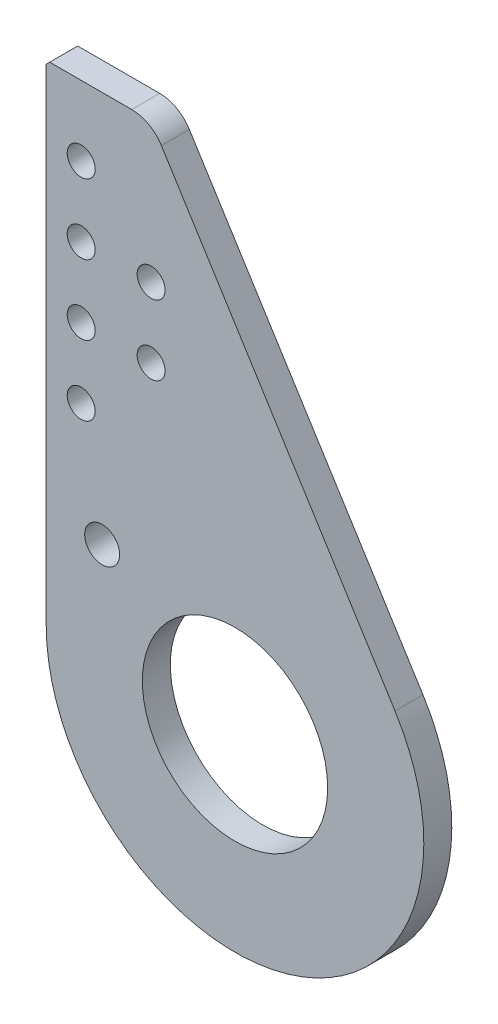
ISO-10303-21;
HEADER;
FILE_DESCRIPTION(('STEP AP214'),'2;1');
FILE_NAME('part.step','',(''),(''),'','','');
FILE_SCHEMA(('AUTOMOTIVE_DESIGN { 1 0 10303 214 1 1 1 1 }'));
ENDSEC;
DATA;
#1=APPLICATION_CONTEXT('core data for automotive mechanical design processes');
#2=APPLICATION_PROTOCOL_DEFINITION('international standard','automotive_design',2000,#1);
#3=PRODUCT_CONTEXT('',#1,'mechanical');
#4=PRODUCT('Part','Part','',(#3));
#5=PRODUCT_RELATED_PRODUCT_CATEGORY('part','',(#4));
#6=PRODUCT_DEFINITION_FORMATION('','',#4);
#7=PRODUCT_DEFINITION_CONTEXT('part definition',#1,'design');
#8=PRODUCT_DEFINITION('design','',#6,#7);
#9=PRODUCT_DEFINITION_SHAPE('','',#8);
#10=(LENGTH_UNIT() NAMED_UNIT(*) SI_UNIT(.MILLI.,.METRE.));
#11=(NAMED_UNIT(*) PLANE_ANGLE_UNIT() SI_UNIT($,.RADIAN.));
#12=(NAMED_UNIT(*) SI_UNIT($,.STERADIAN.) SOLID_ANGLE_UNIT());
#13=UNCERTAINTY_MEASURE_WITH_UNIT(LENGTH_MEASURE(1.E-05),#10,'distance_accuracy_value','');
#14=(GEOMETRIC_REPRESENTATION_CONTEXT(3) GLOBAL_UNCERTAINTY_ASSIGNED_CONTEXT((#13)) GLOBAL_UNIT_ASSIGNED_CONTEXT((#10,
#11,#12)) REPRESENTATION_CONTEXT('',''));
#15=CARTESIAN_POINT('',(0.,0.,0.));
#16=DIRECTION('',(0.,0.,1.));
#17=DIRECTION('',(1.,0.,0.));
#18=AXIS2_PLACEMENT_3D('',#15,#16,#17);
#19=CARTESIAN_POINT('',(0.,0.,4.));
#20=DIRECTION('',(0.,0.,1.));
#21=DIRECTION('',(1.,0.,0.));
#22=AXIS2_PLACEMENT_3D('',#19,#20,#21);
#23=PLANE('',#22);
#24=CARTESIAN_POINT('',(-22.,40.,4.));
#25=DIRECTION('',(0.,0.,1.));
#26=DIRECTION('',(1.,0.,0.));
#27=AXIS2_PLACEMENT_3D('',#24,#25,#26);
#28=CIRCLE('',#27,2.00000000000001);
#29=CARTESIAN_POINT('',(-20.,40.,4.));
#30=VERTEX_POINT('',#29);
#31=EDGE_CURVE('E184',#30,#30,#28,.T.);
#32=ORIENTED_EDGE('',*,*,#31,.F.);
#33=EDGE_LOOP('',(#32));
#34=FACE_BOUND('',#33,.T.);
#35=CARTESIAN_POINT('',(-22.,30.,4.));
#36=DIRECTION('',(0.,0.,1.));
#37=DIRECTION('',(1.,0.,0.));
#38=AXIS2_PLACEMENT_3D('',#35,#36,#37);
#39=CIRCLE('',#38,2.00000000000001);
#40=CARTESIAN_POINT('',(-20.,30.,4.));
#41=VERTEX_POINT('',#40);
#42=EDGE_CURVE('E172',#41,#41,#39,.T.);
#43=ORIENTED_EDGE('',*,*,#42,.F.);
#44=EDGE_LOOP('',(#43));
#45=FACE_BOUND('',#44,.T.);
#46=CARTESIAN_POINT('',(-22.,60.,4.));
#47=DIRECTION('',(0.,0.,1.));
#48=DIRECTION('',(1.,0.,0.));
#49=AXIS2_PLACEMENT_3D('',#46,#47,#48);
#50=CIRCLE('',#49,2.);
#51=CARTESIAN_POINT('',(-20.,60.,4.));
#52=VERTEX_POINT('',#51);
#53=EDGE_CURVE('E160',#52,#52,#50,.T.);
#54=ORIENTED_EDGE('',*,*,#53,.F.);
#55=EDGE_LOOP('',(#54));
#56=FACE_BOUND('',#55,.T.);
#57=CARTESIAN_POINT('',(-12.,40.,4.));
#58=DIRECTION('',(0.,0.,1.));
#59=DIRECTION('',(1.,0.,0.));
#60=AXIS2_PLACEMENT_3D('',#57,#58,#59);
#61=CIRCLE('',#60,2.);
#62=CARTESIAN_POINT('',(-10.,40.,4.));
#63=VERTEX_POINT('',#62);
#64=EDGE_CURVE('E148',#63,#63,#61,.T.);
#65=ORIENTED_EDGE('',*,*,#64,.F.);
#66=EDGE_LOOP('',(#65));
#67=FACE_BOUND('',#66,.T.);
#68=DIRECTION('',(-1.,0.,0.));
#69=VECTOR('',#68,1.);
#70=CARTESIAN_POINT('',(-27.,70.,4.));
#71=LINE('',#70,#69);
#72=CARTESIAN_POINT('',(-14.7674539749688,70.,4.));
#73=VERTEX_POINT('',#72);
#74=CARTESIAN_POINT('',(-26.5,70.,4.));
#75=VERTEX_POINT('',#74);
#76=EDGE_CURVE('E104',#73,#75,#71,.T.);
#77=ORIENTED_EDGE('',*,*,#76,.T.);
#78=DIRECTION('',(0.707106781186548,0.707106781186548,0.));
#79=VECTOR('',#78,1.);
#80=CARTESIAN_POINT('',(-48.25,48.25,4.));
#81=LINE('',#80,#79);
#82=CARTESIAN_POINT('',(-27.,69.5,4.));
#83=VERTEX_POINT('',#82);
#84=EDGE_CURVE('E11',#75,#83,#81,.F.);
#85=ORIENTED_EDGE('',*,*,#84,.T.);
#86=DIRECTION('',(0.,-1.,0.));
#87=VECTOR('',#86,1.);
#88=CARTESIAN_POINT('',(-27.,0.,4.));
#89=LINE('',#88,#87);
#90=CARTESIAN_POINT('',(-27.,0.,4.));
#91=VERTEX_POINT('',#90);
#92=EDGE_CURVE('E110',#83,#91,#89,.T.);
#93=ORIENTED_EDGE('',*,*,#92,.T.);
#94=CARTESIAN_POINT('',(0.,0.,4.));
#95=DIRECTION('',(0.,0.,1.));
#96=DIRECTION('',(1.,0.,0.));
#97=AXIS2_PLACEMENT_3D('',#94,#95,#96);
#98=CIRCLE('',#97,27.);
#99=CARTESIAN_POINT('',(22.8793753525154,14.3364634229893,4.));
#100=VERTEX_POINT('',#99);
#101=EDGE_CURVE('E105',#91,#100,#98,.T.);
#102=ORIENTED_EDGE('',*,*,#101,.T.);
#103=DIRECTION('',(-0.530980126777383,0.847384272315385,0.));
#104=VECTOR('',#103,1.);
#105=CARTESIAN_POINT('',(-11.9999971755815,70.,4.));
#106=LINE('',#105,#104);
#107=CARTESIAN_POINT('',(-10.5305326133919,67.6549006338869,4.));
#108=VERTEX_POINT('',#107);
#109=EDGE_CURVE('E93',#100,#108,#106,.T.);
#110=ORIENTED_EDGE('',*,*,#109,.T.);
#111=CARTESIAN_POINT('',(-14.7674539749688,65.,4.));
#112=DIRECTION('',(0.,0.,1.));
#113=DIRECTION('',(1.,0.,0.));
#114=AXIS2_PLACEMENT_3D('',#111,#112,#113);
#115=CIRCLE('',#114,5.);
#116=EDGE_CURVE('E130',#108,#73,#115,.T.);
#117=ORIENTED_EDGE('',*,*,#116,.T.);
#118=EDGE_LOOP('',(#77,#85,#93,#102,#110,#117));
#119=FACE_BOUND('',#118,.T.);
#120=CARTESIAN_POINT('',(-19.,14.,4.));
#121=DIRECTION('',(0.,0.,1.));
#122=DIRECTION('',(1.,0.,0.));
#123=AXIS2_PLACEMENT_3D('',#120,#121,#122);
#124=CIRCLE('',#123,2.5);
#125=CARTESIAN_POINT('',(-16.5,14.,4.));
#126=VERTEX_POINT('',#125);
#127=EDGE_CURVE('E154',#126,#126,#124,.T.);
#128=ORIENTED_EDGE('',*,*,#127,.F.);
#129=EDGE_LOOP('',(#128));
#130=FACE_BOUND('',#129,.T.);
#131=CARTESIAN_POINT('',(-22.,50.,4.));
#132=DIRECTION('',(0.,0.,1.));
#133=DIRECTION('',(1.,0.,0.));
#134=AXIS2_PLACEMENT_3D('',#131,#132,#133);
#135=CIRCLE('',#134,2.);
#136=CARTESIAN_POINT('',(-20.,50.,4.));
#137=VERTEX_POINT('',#136);
#138=EDGE_CURVE('E166',#137,#137,#135,.T.);
#139=ORIENTED_EDGE('',*,*,#138,.F.);
#140=EDGE_LOOP('',(#139));
#141=FACE_BOUND('',#140,.T.);
#142=CARTESIAN_POINT('',(0.,0.,4.));
#143=DIRECTION('',(0.,0.,1.));
#144=DIRECTION('',(1.,0.,0.));
#145=AXIS2_PLACEMENT_3D('',#142,#143,#144);
#146=CIRCLE('',#145,13.25);
#147=CARTESIAN_POINT('',(13.25,0.,4.));
#148=VERTEX_POINT('',#147);
#149=EDGE_CURVE('E178',#148,#148,#146,.T.);
#150=ORIENTED_EDGE('',*,*,#149,.F.);
#151=EDGE_LOOP('',(#150));
#152=FACE_BOUND('',#151,.T.);
#153=CARTESIAN_POINT('',(-12.,50.,4.));
#154=DIRECTION('',(0.,0.,1.));
#155=DIRECTION('',(1.,0.,0.));
#156=AXIS2_PLACEMENT_3D('',#153,#154,#155);
#157=CIRCLE('',#156,2.);
#158=CARTESIAN_POINT('',(-10.,50.,4.));
#159=VERTEX_POINT('',#158);
#160=EDGE_CURVE('E190',#159,#159,#157,.T.);
#161=ORIENTED_EDGE('',*,*,#160,.F.);
#162=EDGE_LOOP('',(#161));
#163=FACE_BOUND('',#162,.T.);
#164=ADVANCED_FACE('F39',(#34,#45,#56,#67,#119,#130,#141,#152,#163),#23,.T.);
#165=CARTESIAN_POINT('',(0.,0.,0.));
#166=DIRECTION('',(0.,0.,1.));
#167=DIRECTION('',(1.,0.,0.));
#168=AXIS2_PLACEMENT_3D('',#165,#166,#167);
#169=PLANE('',#168);
#170=DIRECTION('',(0.,-1.,0.));
#171=VECTOR('',#170,1.);
#172=CARTESIAN_POINT('',(-27.,0.,0.));
#173=LINE('',#172,#171);
#174=CARTESIAN_POINT('',(-27.,69.5,0.));
#175=VERTEX_POINT('',#174);
#176=CARTESIAN_POINT('',(-27.,0.,0.));
#177=VERTEX_POINT('',#176);
#178=EDGE_CURVE('E114',#175,#177,#173,.T.);
#179=ORIENTED_EDGE('',*,*,#178,.F.);
#180=DIRECTION('',(-0.707106781186548,-0.707106781186548,0.));
#181=VECTOR('',#180,1.);
#182=CARTESIAN_POINT('',(-27.,69.5,0.));
#183=LINE('',#182,#181);
#184=CARTESIAN_POINT('',(-26.5,70.,0.));
#185=VERTEX_POINT('',#184);
#186=EDGE_CURVE('E62',#175,#185,#183,.F.);
#187=ORIENTED_EDGE('',*,*,#186,.T.);
#188=DIRECTION('',(-1.,0.,0.));
#189=VECTOR('',#188,1.);
#190=CARTESIAN_POINT('',(-27.,70.,0.));
#191=LINE('',#190,#189);
#192=CARTESIAN_POINT('',(-14.7674539749688,70.,0.));
#193=VERTEX_POINT('',#192);
#194=EDGE_CURVE('E142',#193,#185,#191,.T.);
#195=ORIENTED_EDGE('',*,*,#194,.F.);
#196=CARTESIAN_POINT('',(-14.7674539749688,65.,0.));
#197=DIRECTION('',(0.,0.,1.));
#198=DIRECTION('',(1.,0.,0.));
#199=AXIS2_PLACEMENT_3D('',#196,#197,#198);
#200=CIRCLE('',#199,5.);
#201=CARTESIAN_POINT('',(-10.5305326133919,67.6549006338869,0.));
#202=VERTEX_POINT('',#201);
#203=EDGE_CURVE('E123',#193,#202,#200,.F.);
#204=ORIENTED_EDGE('',*,*,#203,.T.);
#205=DIRECTION('',(-0.530980126777383,0.847384272315385,0.));
#206=VECTOR('',#205,1.);
#207=CARTESIAN_POINT('',(-11.9999971755815,70.,0.));
#208=LINE('',#207,#206);
#209=CARTESIAN_POINT('',(22.8793753525154,14.3364634229893,0.));
#210=VERTEX_POINT('',#209);
#211=EDGE_CURVE('E143',#210,#202,#208,.T.);
#212=ORIENTED_EDGE('',*,*,#211,.F.);
#213=CARTESIAN_POINT('',(0.,0.,0.));
#214=DIRECTION('',(0.,0.,1.));
#215=DIRECTION('',(1.,0.,0.));
#216=AXIS2_PLACEMENT_3D('',#213,#214,#215);
#217=CIRCLE('',#216,27.);
#218=EDGE_CURVE('E118',#177,#210,#217,.T.);
#219=ORIENTED_EDGE('',*,*,#218,.F.);
#220=EDGE_LOOP('',(#179,#187,#195,#204,#212,#219));
#221=FACE_BOUND('',#220,.T.);
#222=CARTESIAN_POINT('',(-12.,40.,0.));
#223=DIRECTION('',(0.,0.,1.));
#224=DIRECTION('',(1.,0.,0.));
#225=AXIS2_PLACEMENT_3D('',#222,#223,#224);
#226=CIRCLE('',#225,2.);
#227=CARTESIAN_POINT('',(-10.,40.,0.));
#228=VERTEX_POINT('',#227);
#229=EDGE_CURVE('E151',#228,#228,#226,.T.);
#230=ORIENTED_EDGE('',*,*,#229,.T.);
#231=EDGE_LOOP('',(#230));
#232=FACE_BOUND('',#231,.T.);
#233=CARTESIAN_POINT('',(-19.,14.,0.));
#234=DIRECTION('',(0.,0.,1.));
#235=DIRECTION('',(1.,0.,0.));
#236=AXIS2_PLACEMENT_3D('',#233,#234,#235);
#237=CIRCLE('',#236,2.5);
#238=CARTESIAN_POINT('',(-16.5,14.,0.));
#239=VERTEX_POINT('',#238);
#240=EDGE_CURVE('E157',#239,#239,#237,.T.);
#241=ORIENTED_EDGE('',*,*,#240,.T.);
#242=EDGE_LOOP('',(#241));
#243=FACE_BOUND('',#242,.T.);
#244=CARTESIAN_POINT('',(-22.,60.,0.));
#245=DIRECTION('',(0.,0.,1.));
#246=DIRECTION('',(1.,0.,0.));
#247=AXIS2_PLACEMENT_3D('',#244,#245,#246);
#248=CIRCLE('',#247,2.);
#249=CARTESIAN_POINT('',(-20.,60.,0.));
#250=VERTEX_POINT('',#249);
#251=EDGE_CURVE('E163',#250,#250,#248,.T.);
#252=ORIENTED_EDGE('',*,*,#251,.T.);
#253=EDGE_LOOP('',(#252));
#254=FACE_BOUND('',#253,.T.);
#255=CARTESIAN_POINT('',(-22.,50.,0.));
#256=DIRECTION('',(0.,0.,1.));
#257=DIRECTION('',(1.,0.,0.));
#258=AXIS2_PLACEMENT_3D('',#255,#256,#257);
#259=CIRCLE('',#258,2.);
#260=CARTESIAN_POINT('',(-20.,50.,0.));
#261=VERTEX_POINT('',#260);
#262=EDGE_CURVE('E169',#261,#261,#259,.T.);
#263=ORIENTED_EDGE('',*,*,#262,.T.);
#264=EDGE_LOOP('',(#263));
#265=FACE_BOUND('',#264,.T.);
#266=CARTESIAN_POINT('',(-22.,30.,0.));
#267=DIRECTION('',(0.,0.,1.));
#268=DIRECTION('',(1.,0.,0.));
#269=AXIS2_PLACEMENT_3D('',#266,#267,#268);
#270=CIRCLE('',#269,2.00000000000001);
#271=CARTESIAN_POINT('',(-20.,30.,0.));
#272=VERTEX_POINT('',#271);
#273=EDGE_CURVE('E175',#272,#272,#270,.T.);
#274=ORIENTED_EDGE('',*,*,#273,.T.);
#275=EDGE_LOOP('',(#274));
#276=FACE_BOUND('',#275,.T.);
#277=CARTESIAN_POINT('',(0.,0.,0.));
#278=DIRECTION('',(0.,0.,1.));
#279=DIRECTION('',(1.,0.,0.));
#280=AXIS2_PLACEMENT_3D('',#277,#278,#279);
#281=CIRCLE('',#280,13.25);
#282=CARTESIAN_POINT('',(13.25,0.,0.));
#283=VERTEX_POINT('',#282);
#284=EDGE_CURVE('E181',#283,#283,#281,.T.);
#285=ORIENTED_EDGE('',*,*,#284,.T.);
#286=EDGE_LOOP('',(#285));
#287=FACE_BOUND('',#286,.T.);
#288=CARTESIAN_POINT('',(-22.,40.,0.));
#289=DIRECTION('',(0.,0.,1.));
#290=DIRECTION('',(1.,0.,0.));
#291=AXIS2_PLACEMENT_3D('',#288,#289,#290);
#292=CIRCLE('',#291,2.00000000000001);
#293=CARTESIAN_POINT('',(-20.,40.,0.));
#294=VERTEX_POINT('',#293);
#295=EDGE_CURVE('E187',#294,#294,#292,.T.);
#296=ORIENTED_EDGE('',*,*,#295,.T.);
#297=EDGE_LOOP('',(#296));
#298=FACE_BOUND('',#297,.T.);
#299=CARTESIAN_POINT('',(-12.,50.,0.));
#300=DIRECTION('',(0.,0.,1.));
#301=DIRECTION('',(1.,0.,0.));
#302=AXIS2_PLACEMENT_3D('',#299,#300,#301);
#303=CIRCLE('',#302,2.);
#304=CARTESIAN_POINT('',(-10.,50.,0.));
#305=VERTEX_POINT('',#304);
#306=EDGE_CURVE('E193',#305,#305,#303,.T.);
#307=ORIENTED_EDGE('',*,*,#306,.T.);
#308=EDGE_LOOP('',(#307));
#309=FACE_BOUND('',#308,.T.);
#310=ADVANCED_FACE('F140',(#221,#232,#243,#254,#265,#276,#287,#298,#309),#169,.F.);
#311=CARTESIAN_POINT('',(0.,0.,4.));
#312=DIRECTION('',(0.,0.,-1.));
#313=DIRECTION('',(-1.,0.,0.));
#314=AXIS2_PLACEMENT_3D('',#311,#312,#313);
#315=CYLINDRICAL_SURFACE('',#314,27.);
#316=ORIENTED_EDGE('',*,*,#218,.T.);
#317=DIRECTION('',(0.,0.,-1.));
#318=VECTOR('',#317,1.);
#319=CARTESIAN_POINT('',(22.8793753525154,14.3364634229893,4.));
#320=LINE('',#319,#318);
#321=EDGE_CURVE('E98',#100,#210,#320,.T.);
#322=ORIENTED_EDGE('',*,*,#321,.F.);
#323=ORIENTED_EDGE('',*,*,#101,.F.);
#324=DIRECTION('',(0.,0.,-1.));
#325=VECTOR('',#324,1.);
#326=CARTESIAN_POINT('',(-27.,0.,4.));
#327=LINE('',#326,#325);
#328=EDGE_CURVE('E120',#91,#177,#327,.T.);
#329=ORIENTED_EDGE('',*,*,#328,.T.);
#330=EDGE_LOOP('',(#316,#322,#323,#329));
#331=FACE_BOUND('',#330,.T.);
#332=ADVANCED_FACE('F116',(#331),#315,.T.);
#333=CARTESIAN_POINT('',(-11.9999971755815,70.,4.));
#334=DIRECTION('',(-0.847384272315385,-0.530980126777383,0.));
#335=DIRECTION('',(0.530980126777383,-0.847384272315385,0.));
#336=AXIS2_PLACEMENT_3D('',#333,#334,#335);
#337=PLANE('',#336);
#338=ORIENTED_EDGE('',*,*,#211,.T.);
#339=DIRECTION('',(0.,0.,-1.));
#340=VECTOR('',#339,1.);
#341=CARTESIAN_POINT('',(-10.5305326133919,67.6549006338869,4.));
#342=LINE('',#341,#340);
#343=EDGE_CURVE('E101',#202,#108,#342,.F.);
#344=ORIENTED_EDGE('',*,*,#343,.T.);
#345=ORIENTED_EDGE('',*,*,#109,.F.);
#346=ORIENTED_EDGE('',*,*,#321,.T.);
#347=EDGE_LOOP('',(#338,#344,#345,#346));
#348=FACE_BOUND('',#347,.T.);
#349=ADVANCED_FACE('F96',(#348),#337,.F.);
#350=CARTESIAN_POINT('',(-27.,70.,4.));
#351=DIRECTION('',(0.,-1.,0.));
#352=DIRECTION('',(0.,0.,-1.));
#353=AXIS2_PLACEMENT_3D('',#350,#351,#352);
#354=PLANE('',#353);
#355=ORIENTED_EDGE('',*,*,#194,.T.);
#356=DIRECTION('',(0.,0.,1.));
#357=VECTOR('',#356,1.);
#358=CARTESIAN_POINT('',(-26.5,70.,4.));
#359=LINE('',#358,#357);
#360=EDGE_CURVE('E48',#185,#75,#359,.T.);
#361=ORIENTED_EDGE('',*,*,#360,.T.);
#362=ORIENTED_EDGE('',*,*,#76,.F.);
#363=DIRECTION('',(0.,0.,-1.));
#364=VECTOR('',#363,1.);
#365=CARTESIAN_POINT('',(-14.7674539749688,70.,4.));
#366=LINE('',#365,#364);
#367=EDGE_CURVE('E119',#73,#193,#366,.T.);
#368=ORIENTED_EDGE('',*,*,#367,.T.);
#369=EDGE_LOOP('',(#355,#361,#362,#368));
#370=FACE_BOUND('',#369,.T.);
#371=ADVANCED_FACE('F217',(#370),#354,.F.);
#372=CARTESIAN_POINT('',(-27.,0.,4.));
#373=DIRECTION('',(1.,0.,0.));
#374=DIRECTION('',(0.,0.,-1.));
#375=AXIS2_PLACEMENT_3D('',#372,#373,#374);
#376=PLANE('',#375);
#377=ORIENTED_EDGE('',*,*,#92,.F.);
#378=DIRECTION('',(0.,0.,-1.));
#379=VECTOR('',#378,1.);
#380=CARTESIAN_POINT('',(-27.,69.5,4.));
#381=LINE('',#380,#379);
#382=EDGE_CURVE('E132',#83,#175,#381,.T.);
#383=ORIENTED_EDGE('',*,*,#382,.T.);
#384=ORIENTED_EDGE('',*,*,#178,.T.);
#385=ORIENTED_EDGE('',*,*,#328,.F.);
#386=EDGE_LOOP('',(#377,#383,#384,#385));
#387=FACE_BOUND('',#386,.T.);
#388=ADVANCED_FACE('F137',(#387),#376,.F.);
#389=CARTESIAN_POINT('',(-12.,40.,4.));
#390=DIRECTION('',(0.,0.,-1.));
#391=DIRECTION('',(-1.,0.,0.));
#392=AXIS2_PLACEMENT_3D('',#389,#390,#391);
#393=CYLINDRICAL_SURFACE('',#392,2.);
#394=ORIENTED_EDGE('',*,*,#64,.T.);
#395=EDGE_LOOP('',(#394));
#396=FACE_BOUND('',#395,.T.);
#397=ORIENTED_EDGE('',*,*,#229,.F.);
#398=EDGE_LOOP('',(#397));
#399=FACE_BOUND('',#398,.T.);
#400=ADVANCED_FACE('F212',(#396,#399),#393,.F.);
#401=CARTESIAN_POINT('',(-19.,14.,4.));
#402=DIRECTION('',(0.,0.,-1.));
#403=DIRECTION('',(-1.,0.,0.));
#404=AXIS2_PLACEMENT_3D('',#401,#402,#403);
#405=CYLINDRICAL_SURFACE('',#404,2.5);
#406=ORIENTED_EDGE('',*,*,#127,.T.);
#407=EDGE_LOOP('',(#406));
#408=FACE_BOUND('',#407,.T.);
#409=ORIENTED_EDGE('',*,*,#240,.F.);
#410=EDGE_LOOP('',(#409));
#411=FACE_BOUND('',#410,.T.);
#412=ADVANCED_FACE('F253',(#408,#411),#405,.F.);
#413=CARTESIAN_POINT('',(-22.,60.,4.));
#414=DIRECTION('',(0.,0.,-1.));
#415=DIRECTION('',(-1.,0.,0.));
#416=AXIS2_PLACEMENT_3D('',#413,#414,#415);
#417=CYLINDRICAL_SURFACE('',#416,2.);
#418=ORIENTED_EDGE('',*,*,#53,.T.);
#419=EDGE_LOOP('',(#418));
#420=FACE_BOUND('',#419,.T.);
#421=ORIENTED_EDGE('',*,*,#251,.F.);
#422=EDGE_LOOP('',(#421));
#423=FACE_BOUND('',#422,.T.);
#424=ADVANCED_FACE('F250',(#420,#423),#417,.F.);
#425=CARTESIAN_POINT('',(-22.,50.,4.));
#426=DIRECTION('',(0.,0.,-1.));
#427=DIRECTION('',(-1.,0.,0.));
#428=AXIS2_PLACEMENT_3D('',#425,#426,#427);
#429=CYLINDRICAL_SURFACE('',#428,2.);
#430=ORIENTED_EDGE('',*,*,#138,.T.);
#431=EDGE_LOOP('',(#430));
#432=FACE_BOUND('',#431,.T.);
#433=ORIENTED_EDGE('',*,*,#262,.F.);
#434=EDGE_LOOP('',(#433));
#435=FACE_BOUND('',#434,.T.);
#436=ADVANCED_FACE('F246',(#432,#435),#429,.F.);
#437=CARTESIAN_POINT('',(-22.,30.,4.));
#438=DIRECTION('',(0.,0.,-1.));
#439=DIRECTION('',(-1.,0.,0.));
#440=AXIS2_PLACEMENT_3D('',#437,#438,#439);
#441=CYLINDRICAL_SURFACE('',#440,2.00000000000001);
#442=ORIENTED_EDGE('',*,*,#42,.T.);
#443=EDGE_LOOP('',(#442));
#444=FACE_BOUND('',#443,.T.);
#445=ORIENTED_EDGE('',*,*,#273,.F.);
#446=EDGE_LOOP('',(#445));
#447=FACE_BOUND('',#446,.T.);
#448=ADVANCED_FACE('F242',(#444,#447),#441,.F.);
#449=CARTESIAN_POINT('',(0.,0.,4.));
#450=DIRECTION('',(0.,0.,-1.));
#451=DIRECTION('',(-1.,0.,0.));
#452=AXIS2_PLACEMENT_3D('',#449,#450,#451);
#453=CYLINDRICAL_SURFACE('',#452,13.25);
#454=ORIENTED_EDGE('',*,*,#149,.T.);
#455=EDGE_LOOP('',(#454));
#456=FACE_BOUND('',#455,.T.);
#457=ORIENTED_EDGE('',*,*,#284,.F.);
#458=EDGE_LOOP('',(#457));
#459=FACE_BOUND('',#458,.T.);
#460=ADVANCED_FACE('F236',(#456,#459),#453,.F.);
#461=CARTESIAN_POINT('',(-22.,40.,4.));
#462=DIRECTION('',(0.,0.,-1.));
#463=DIRECTION('',(-1.,0.,0.));
#464=AXIS2_PLACEMENT_3D('',#461,#462,#463);
#465=CYLINDRICAL_SURFACE('',#464,2.00000000000001);
#466=ORIENTED_EDGE('',*,*,#31,.T.);
#467=EDGE_LOOP('',(#466));
#468=FACE_BOUND('',#467,.T.);
#469=ORIENTED_EDGE('',*,*,#295,.F.);
#470=EDGE_LOOP('',(#469));
#471=FACE_BOUND('',#470,.T.);
#472=ADVANCED_FACE('F230',(#468,#471),#465,.F.);
#473=CARTESIAN_POINT('',(-12.,50.,4.));
#474=DIRECTION('',(0.,0.,-1.));
#475=DIRECTION('',(-1.,0.,0.));
#476=AXIS2_PLACEMENT_3D('',#473,#474,#475);
#477=CYLINDRICAL_SURFACE('',#476,2.);
#478=ORIENTED_EDGE('',*,*,#160,.T.);
#479=EDGE_LOOP('',(#478));
#480=FACE_BOUND('',#479,.T.);
#481=ORIENTED_EDGE('',*,*,#306,.F.);
#482=EDGE_LOOP('',(#481));
#483=FACE_BOUND('',#482,.T.);
#484=ADVANCED_FACE('F199',(#480,#483),#477,.F.);
#485=CARTESIAN_POINT('',(-14.7674539749688,65.,4.));
#486=DIRECTION('',(0.,0.,-1.));
#487=DIRECTION('',(-1.,0.,0.));
#488=AXIS2_PLACEMENT_3D('',#485,#486,#487);
#489=CYLINDRICAL_SURFACE('',#488,5.);
#490=ORIENTED_EDGE('',*,*,#116,.F.);
#491=ORIENTED_EDGE('',*,*,#343,.F.);
#492=ORIENTED_EDGE('',*,*,#203,.F.);
#493=ORIENTED_EDGE('',*,*,#367,.F.);
#494=EDGE_LOOP('',(#490,#491,#492,#493));
#495=FACE_BOUND('',#494,.T.);
#496=ADVANCED_FACE('F223',(#495),#489,.T.);
#497=CARTESIAN_POINT('',(-27.,69.5,4.));
#498=DIRECTION('',(0.707106781186547,-0.707106781186547,0.));
#499=DIRECTION('',(0.,0.,-1.));
#500=AXIS2_PLACEMENT_3D('',#497,#498,#499);
#501=PLANE('',#500);
#502=ORIENTED_EDGE('',*,*,#84,.F.);
#503=ORIENTED_EDGE('',*,*,#360,.F.);
#504=ORIENTED_EDGE('',*,*,#186,.F.);
#505=ORIENTED_EDGE('',*,*,#382,.F.);
#506=EDGE_LOOP('',(#502,#503,#504,#505));
#507=FACE_BOUND('',#506,.T.);
#508=ADVANCED_FACE('F42',(#507),#501,.F.);
#509=CLOSED_SHELL('',(#164,#310,#332,#349,#371,#388,#400,#412,#424,#436,#448,#460,#472,#484,
#496,#508));
#510=MANIFOLD_SOLID_BREP('B2',#509);
#511=ADVANCED_BREP_SHAPE_REPRESENTATION('',(#18,#510),#14);
#512=SHAPE_DEFINITION_REPRESENTATION(#9,#511);
ENDSEC;
END-ISO-10303-21;
